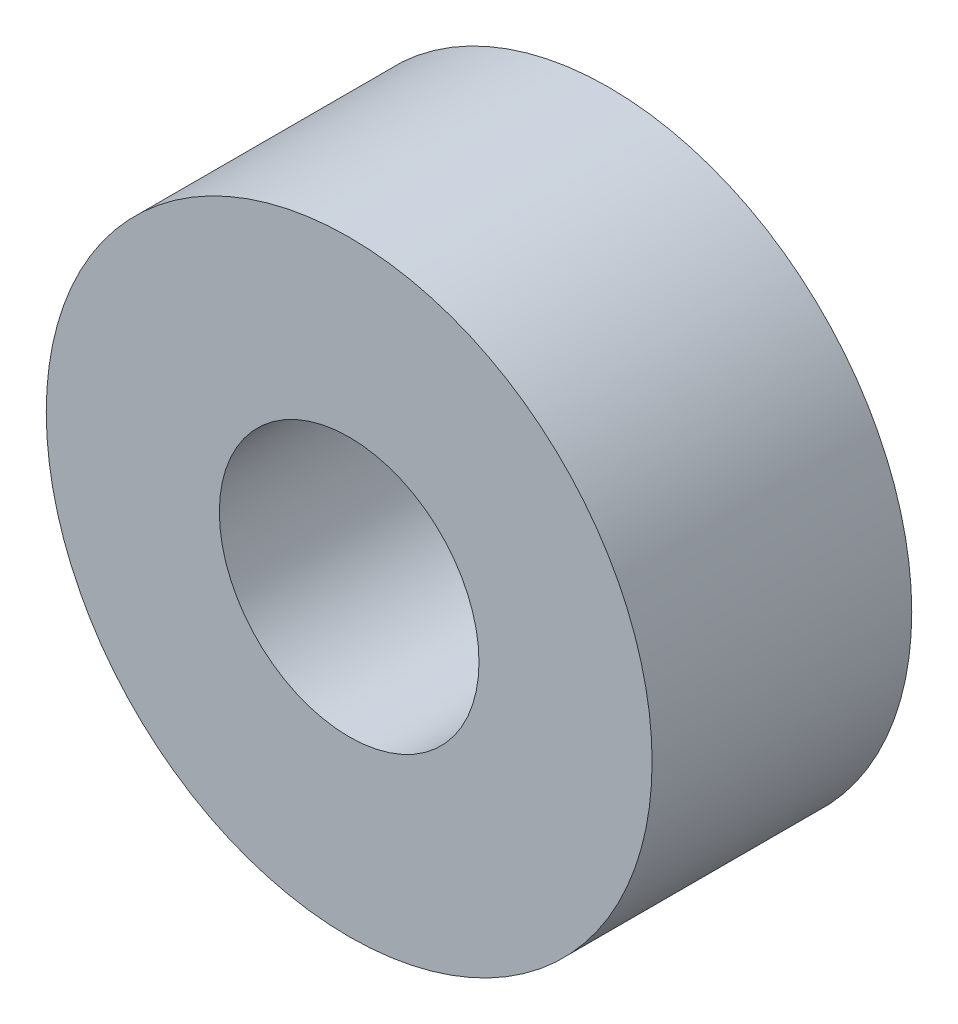
ISO-10303-21;
HEADER;
FILE_DESCRIPTION(('STEP AP214'),'2;1');
FILE_NAME('part.step','',(''),(''),'','','');
FILE_SCHEMA(('AUTOMOTIVE_DESIGN { 1 0 10303 214 1 1 1 1 }'));
ENDSEC;
DATA;
#1=APPLICATION_CONTEXT('core data for automotive mechanical design processes');
#2=APPLICATION_PROTOCOL_DEFINITION('international standard','automotive_design',2000,#1);
#3=PRODUCT_CONTEXT('',#1,'mechanical');
#4=PRODUCT('Part','Part','',(#3));
#5=PRODUCT_RELATED_PRODUCT_CATEGORY('part','',(#4));
#6=PRODUCT_DEFINITION_FORMATION('','',#4);
#7=PRODUCT_DEFINITION_CONTEXT('part definition',#1,'design');
#8=PRODUCT_DEFINITION('design','',#6,#7);
#9=PRODUCT_DEFINITION_SHAPE('','',#8);
#10=(LENGTH_UNIT() NAMED_UNIT(*) SI_UNIT(.MILLI.,.METRE.));
#11=(NAMED_UNIT(*) PLANE_ANGLE_UNIT() SI_UNIT($,.RADIAN.));
#12=(NAMED_UNIT(*) SI_UNIT($,.STERADIAN.) SOLID_ANGLE_UNIT());
#13=UNCERTAINTY_MEASURE_WITH_UNIT(LENGTH_MEASURE(1.E-05),#10,'distance_accuracy_value','');
#14=(GEOMETRIC_REPRESENTATION_CONTEXT(3) GLOBAL_UNCERTAINTY_ASSIGNED_CONTEXT((#13)) GLOBAL_UNIT_ASSIGNED_CONTEXT((#10,
#11,#12)) REPRESENTATION_CONTEXT('',''));
#15=CARTESIAN_POINT('',(0.,0.,0.));
#16=DIRECTION('',(0.,0.,1.));
#17=DIRECTION('',(1.,0.,0.));
#18=AXIS2_PLACEMENT_3D('',#15,#16,#17);
#19=CARTESIAN_POINT('',(0.,0.,30.));
#20=DIRECTION('',(0.,0.,1.));
#21=DIRECTION('',(1.,0.,0.));
#22=AXIS2_PLACEMENT_3D('',#19,#20,#21);
#23=PLANE('',#22);
#24=CARTESIAN_POINT('',(0.,0.,30.));
#25=DIRECTION('',(0.,0.,1.));
#26=DIRECTION('',(1.,0.,0.));
#27=AXIS2_PLACEMENT_3D('',#24,#25,#26);
#28=CIRCLE('',#27,35.);
#29=CARTESIAN_POINT('',(35.,0.,30.));
#30=VERTEX_POINT('',#29);
#31=EDGE_CURVE('E10',#30,#30,#28,.T.);
#32=ORIENTED_EDGE('',*,*,#31,.T.);
#33=EDGE_LOOP('',(#32));
#34=FACE_BOUND('',#33,.T.);
#35=CARTESIAN_POINT('',(0.,0.,30.));
#36=DIRECTION('',(0.,0.,1.));
#37=DIRECTION('',(1.,0.,0.));
#38=AXIS2_PLACEMENT_3D('',#35,#36,#37);
#39=CIRCLE('',#38,15.);
#40=CARTESIAN_POINT('',(15.,0.,30.));
#41=VERTEX_POINT('',#40);
#42=EDGE_CURVE('E50',#41,#41,#39,.T.);
#43=ORIENTED_EDGE('',*,*,#42,.F.);
#44=EDGE_LOOP('',(#43));
#45=FACE_BOUND('',#44,.T.);
#46=ADVANCED_FACE('F37',(#34,#45),#23,.T.);
#47=CARTESIAN_POINT('',(0.,0.,0.));
#48=DIRECTION('',(0.,0.,1.));
#49=DIRECTION('',(1.,0.,0.));
#50=AXIS2_PLACEMENT_3D('',#47,#48,#49);
#51=PLANE('',#50);
#52=CARTESIAN_POINT('',(0.,0.,0.));
#53=DIRECTION('',(0.,0.,1.));
#54=DIRECTION('',(1.,0.,0.));
#55=AXIS2_PLACEMENT_3D('',#52,#53,#54);
#56=CIRCLE('',#55,35.);
#57=CARTESIAN_POINT('',(35.,0.,0.));
#58=VERTEX_POINT('',#57);
#59=EDGE_CURVE('E41',#58,#58,#56,.T.);
#60=ORIENTED_EDGE('',*,*,#59,.F.);
#61=EDGE_LOOP('',(#60));
#62=FACE_BOUND('',#61,.T.);
#63=CARTESIAN_POINT('',(0.,0.,0.));
#64=DIRECTION('',(0.,0.,1.));
#65=DIRECTION('',(1.,0.,0.));
#66=AXIS2_PLACEMENT_3D('',#63,#64,#65);
#67=CIRCLE('',#66,15.);
#68=CARTESIAN_POINT('',(15.,0.,0.));
#69=VERTEX_POINT('',#68);
#70=EDGE_CURVE('E52',#69,#69,#67,.T.);
#71=ORIENTED_EDGE('',*,*,#70,.T.);
#72=EDGE_LOOP('',(#71));
#73=FACE_BOUND('',#72,.T.);
#74=ADVANCED_FACE('F64',(#62,#73),#51,.F.);
#75=CARTESIAN_POINT('',(0.,0.,30.));
#76=DIRECTION('',(0.,0.,-1.));
#77=DIRECTION('',(-1.,0.,0.));
#78=AXIS2_PLACEMENT_3D('',#75,#76,#77);
#79=CYLINDRICAL_SURFACE('',#78,35.);
#80=ORIENTED_EDGE('',*,*,#31,.F.);
#81=EDGE_LOOP('',(#80));
#82=FACE_BOUND('',#81,.T.);
#83=ORIENTED_EDGE('',*,*,#59,.T.);
#84=EDGE_LOOP('',(#83));
#85=FACE_BOUND('',#84,.T.);
#86=ADVANCED_FACE('F39',(#82,#85),#79,.T.);
#87=CARTESIAN_POINT('',(0.,0.,30.));
#88=DIRECTION('',(0.,0.,-1.));
#89=DIRECTION('',(-1.,0.,0.));
#90=AXIS2_PLACEMENT_3D('',#87,#88,#89);
#91=CYLINDRICAL_SURFACE('',#90,15.);
#92=ORIENTED_EDGE('',*,*,#42,.T.);
#93=EDGE_LOOP('',(#92));
#94=FACE_BOUND('',#93,.T.);
#95=ORIENTED_EDGE('',*,*,#70,.F.);
#96=EDGE_LOOP('',(#95));
#97=FACE_BOUND('',#96,.T.);
#98=ADVANCED_FACE('F60',(#94,#97),#91,.F.);
#99=CLOSED_SHELL('',(#46,#74,#86,#98));
#100=MANIFOLD_SOLID_BREP('B2',#99);
#101=ADVANCED_BREP_SHAPE_REPRESENTATION('',(#18,#100),#14);
#102=SHAPE_DEFINITION_REPRESENTATION(#9,#101);
ENDSEC;
END-ISO-10303-21;
